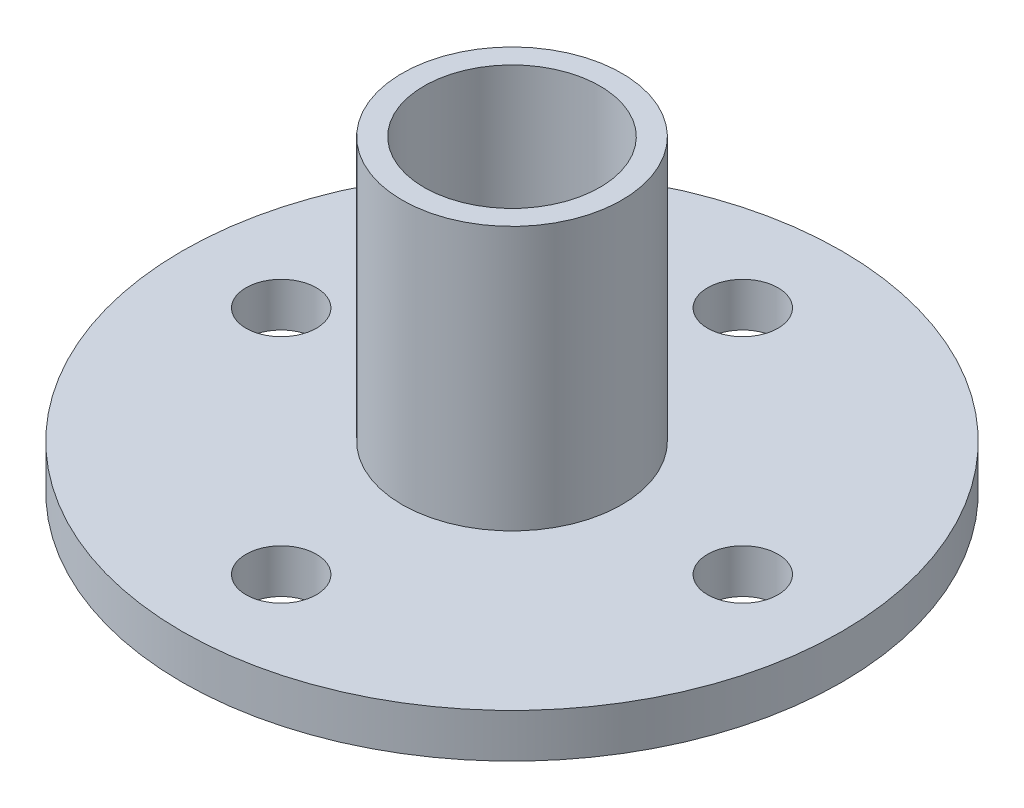
ISO-10303-21;
HEADER;
FILE_DESCRIPTION(('STEP AP214'),'2;1');
FILE_NAME('part.step','',(''),(''),'','','');
FILE_SCHEMA(('AUTOMOTIVE_DESIGN { 1 0 10303 214 1 1 1 1 }'));
ENDSEC;
DATA;
#1=APPLICATION_CONTEXT('core data for automotive mechanical design processes');
#2=APPLICATION_PROTOCOL_DEFINITION('international standard','automotive_design',2000,#1);
#3=PRODUCT_CONTEXT('',#1,'mechanical');
#4=PRODUCT('Part','Part','',(#3));
#5=PRODUCT_RELATED_PRODUCT_CATEGORY('part','',(#4));
#6=PRODUCT_DEFINITION_FORMATION('','',#4);
#7=PRODUCT_DEFINITION_CONTEXT('part definition',#1,'design');
#8=PRODUCT_DEFINITION('design','',#6,#7);
#9=PRODUCT_DEFINITION_SHAPE('','',#8);
#10=(LENGTH_UNIT() NAMED_UNIT(*) SI_UNIT(.MILLI.,.METRE.));
#11=(NAMED_UNIT(*) PLANE_ANGLE_UNIT() SI_UNIT($,.RADIAN.));
#12=(NAMED_UNIT(*) SI_UNIT($,.STERADIAN.) SOLID_ANGLE_UNIT());
#13=UNCERTAINTY_MEASURE_WITH_UNIT(LENGTH_MEASURE(1.E-05),#10,'distance_accuracy_value','');
#14=(GEOMETRIC_REPRESENTATION_CONTEXT(3) GLOBAL_UNCERTAINTY_ASSIGNED_CONTEXT((#13)) GLOBAL_UNIT_ASSIGNED_CONTEXT((#10,
#11,#12)) REPRESENTATION_CONTEXT('',''));
#15=CARTESIAN_POINT('',(0.,0.,0.));
#16=DIRECTION('',(0.,0.,1.));
#17=DIRECTION('',(1.,0.,0.));
#18=AXIS2_PLACEMENT_3D('',#15,#16,#17);
#19=CARTESIAN_POINT('',(0.,2.,0.));
#20=DIRECTION('',(0.,-1.,0.));
#21=DIRECTION('',(0.,0.,-1.));
#22=AXIS2_PLACEMENT_3D('',#19,#20,#21);
#23=CYLINDRICAL_SURFACE('',#22,15.);
#24=CARTESIAN_POINT('',(0.,2.,0.));
#25=DIRECTION('',(0.,1.,0.));
#26=DIRECTION('',(0.,0.,1.));
#27=AXIS2_PLACEMENT_3D('',#24,#25,#26);
#28=CIRCLE('',#27,15.);
#29=CARTESIAN_POINT('',(0.,2.,15.));
#30=VERTEX_POINT('',#29);
#31=EDGE_CURVE('E10',#30,#30,#28,.T.);
#32=ORIENTED_EDGE('',*,*,#31,.F.);
#33=EDGE_LOOP('',(#32));
#34=FACE_BOUND('',#33,.T.);
#35=CARTESIAN_POINT('',(0.,0.,0.));
#36=DIRECTION('',(0.,1.,0.));
#37=DIRECTION('',(0.,0.,1.));
#38=AXIS2_PLACEMENT_3D('',#35,#36,#37);
#39=CIRCLE('',#38,15.);
#40=CARTESIAN_POINT('',(0.,0.,15.));
#41=VERTEX_POINT('',#40);
#42=EDGE_CURVE('E44',#41,#41,#39,.T.);
#43=ORIENTED_EDGE('',*,*,#42,.T.);
#44=EDGE_LOOP('',(#43));
#45=FACE_BOUND('',#44,.T.);
#46=ADVANCED_FACE('F37',(#34,#45),#23,.T.);
#47=CARTESIAN_POINT('',(0.,2.,0.));
#48=DIRECTION('',(0.,1.,0.));
#49=DIRECTION('',(0.,0.,1.));
#50=AXIS2_PLACEMENT_3D('',#47,#48,#49);
#51=PLANE('',#50);
#52=CARTESIAN_POINT('',(0.,2.,-10.5));
#53=DIRECTION('',(0.,1.,0.));
#54=DIRECTION('',(0.,0.,1.));
#55=AXIS2_PLACEMENT_3D('',#52,#53,#54);
#56=CIRCLE('',#55,1.6);
#57=CARTESIAN_POINT('',(0.,2.,-8.9));
#58=VERTEX_POINT('',#57);
#59=EDGE_CURVE('E63',#58,#58,#56,.T.);
#60=ORIENTED_EDGE('',*,*,#59,.F.);
#61=EDGE_LOOP('',(#60));
#62=FACE_BOUND('',#61,.T.);
#63=CARTESIAN_POINT('',(10.5,2.,0.));
#64=DIRECTION('',(0.,1.,0.));
#65=DIRECTION('',(0.,0.,1.));
#66=AXIS2_PLACEMENT_3D('',#63,#64,#65);
#67=CIRCLE('',#66,1.6);
#68=CARTESIAN_POINT('',(10.5,2.,1.60000000000004));
#69=VERTEX_POINT('',#68);
#70=EDGE_CURVE('E134',#69,#69,#67,.T.);
#71=ORIENTED_EDGE('',*,*,#70,.F.);
#72=EDGE_LOOP('',(#71));
#73=FACE_BOUND('',#72,.T.);
#74=CARTESIAN_POINT('',(0.,2.,10.5));
#75=DIRECTION('',(0.,1.,0.));
#76=DIRECTION('',(0.,0.,1.));
#77=AXIS2_PLACEMENT_3D('',#74,#75,#76);
#78=CIRCLE('',#77,1.6);
#79=CARTESIAN_POINT('',(0.,2.,12.1));
#80=VERTEX_POINT('',#79);
#81=EDGE_CURVE('E124',#80,#80,#78,.T.);
#82=ORIENTED_EDGE('',*,*,#81,.F.);
#83=EDGE_LOOP('',(#82));
#84=FACE_BOUND('',#83,.T.);
#85=CARTESIAN_POINT('',(-10.5,2.,-1.09981662173559E-13));
#86=DIRECTION('',(0.,1.,0.));
#87=DIRECTION('',(0.,0.,1.));
#88=AXIS2_PLACEMENT_3D('',#85,#86,#87);
#89=CIRCLE('',#88,1.6);
#90=CARTESIAN_POINT('',(-10.5,2.,1.59999999999989));
#91=VERTEX_POINT('',#90);
#92=EDGE_CURVE('E135',#91,#91,#89,.T.);
#93=ORIENTED_EDGE('',*,*,#92,.F.);
#94=EDGE_LOOP('',(#93));
#95=FACE_BOUND('',#94,.T.);
#96=CARTESIAN_POINT('',(0.,2.,0.));
#97=DIRECTION('',(0.,1.,0.));
#98=DIRECTION('',(0.,0.,1.));
#99=AXIS2_PLACEMENT_3D('',#96,#97,#98);
#100=CIRCLE('',#99,5.);
#101=CARTESIAN_POINT('',(0.,2.,5.));
#102=VERTEX_POINT('',#101);
#103=EDGE_CURVE('E52',#102,#102,#100,.T.);
#104=ORIENTED_EDGE('',*,*,#103,.F.);
#105=EDGE_LOOP('',(#104));
#106=FACE_BOUND('',#105,.T.);
#107=ORIENTED_EDGE('',*,*,#31,.T.);
#108=EDGE_LOOP('',(#107));
#109=FACE_BOUND('',#108,.T.);
#110=ADVANCED_FACE('F87',(#62,#73,#84,#95,#106,#109),#51,.T.);
#111=CARTESIAN_POINT('',(0.,0.,0.));
#112=DIRECTION('',(0.,1.,0.));
#113=DIRECTION('',(0.,0.,1.));
#114=AXIS2_PLACEMENT_3D('',#111,#112,#113);
#115=PLANE('',#114);
#116=CARTESIAN_POINT('',(0.,0.,-10.5));
#117=DIRECTION('',(0.,1.,0.));
#118=DIRECTION('',(0.,0.,1.));
#119=AXIS2_PLACEMENT_3D('',#116,#117,#118);
#120=CIRCLE('',#119,1.6);
#121=CARTESIAN_POINT('',(0.,0.,-8.9));
#122=VERTEX_POINT('',#121);
#123=EDGE_CURVE('E40',#122,#122,#120,.T.);
#124=ORIENTED_EDGE('',*,*,#123,.T.);
#125=EDGE_LOOP('',(#124));
#126=FACE_BOUND('',#125,.T.);
#127=CARTESIAN_POINT('',(10.5,0.,0.));
#128=DIRECTION('',(0.,1.,0.));
#129=DIRECTION('',(0.,0.,1.));
#130=AXIS2_PLACEMENT_3D('',#127,#128,#129);
#131=CIRCLE('',#130,1.6);
#132=CARTESIAN_POINT('',(10.5,0.,1.60000000000004));
#133=VERTEX_POINT('',#132);
#134=EDGE_CURVE('E65',#133,#133,#131,.T.);
#135=ORIENTED_EDGE('',*,*,#134,.T.);
#136=EDGE_LOOP('',(#135));
#137=FACE_BOUND('',#136,.T.);
#138=CARTESIAN_POINT('',(0.,0.,10.5));
#139=DIRECTION('',(0.,1.,0.));
#140=DIRECTION('',(0.,0.,1.));
#141=AXIS2_PLACEMENT_3D('',#138,#139,#140);
#142=CIRCLE('',#141,1.6);
#143=CARTESIAN_POINT('',(0.,0.,12.1));
#144=VERTEX_POINT('',#143);
#145=EDGE_CURVE('E62',#144,#144,#142,.T.);
#146=ORIENTED_EDGE('',*,*,#145,.T.);
#147=EDGE_LOOP('',(#146));
#148=FACE_BOUND('',#147,.T.);
#149=CARTESIAN_POINT('',(-10.5,0.,-1.09981662173559E-13));
#150=DIRECTION('',(0.,1.,0.));
#151=DIRECTION('',(0.,0.,1.));
#152=AXIS2_PLACEMENT_3D('',#149,#150,#151);
#153=CIRCLE('',#152,1.6);
#154=CARTESIAN_POINT('',(-10.5,0.,1.59999999999989));
#155=VERTEX_POINT('',#154);
#156=EDGE_CURVE('E59',#155,#155,#153,.T.);
#157=ORIENTED_EDGE('',*,*,#156,.T.);
#158=EDGE_LOOP('',(#157));
#159=FACE_BOUND('',#158,.T.);
#160=CARTESIAN_POINT('',(0.,0.,0.));
#161=DIRECTION('',(0.,1.,0.));
#162=DIRECTION('',(0.,0.,1.));
#163=AXIS2_PLACEMENT_3D('',#160,#161,#162);
#164=CIRCLE('',#163,4.);
#165=CARTESIAN_POINT('',(0.,0.,4.));
#166=VERTEX_POINT('',#165);
#167=EDGE_CURVE('E55',#166,#166,#164,.T.);
#168=ORIENTED_EDGE('',*,*,#167,.T.);
#169=EDGE_LOOP('',(#168));
#170=FACE_BOUND('',#169,.T.);
#171=ORIENTED_EDGE('',*,*,#42,.F.);
#172=EDGE_LOOP('',(#171));
#173=FACE_BOUND('',#172,.T.);
#174=ADVANCED_FACE('F72',(#126,#137,#148,#159,#170,#173),#115,.F.);
#175=CARTESIAN_POINT('',(0.,14.,0.));
#176=DIRECTION('',(0.,1.,0.));
#177=DIRECTION('',(0.,0.,1.));
#178=AXIS2_PLACEMENT_3D('',#175,#176,#177);
#179=PLANE('',#178);
#180=CARTESIAN_POINT('',(0.,14.,0.));
#181=DIRECTION('',(0.,1.,0.));
#182=DIRECTION('',(0.,0.,1.));
#183=AXIS2_PLACEMENT_3D('',#180,#181,#182);
#184=CIRCLE('',#183,5.);
#185=CARTESIAN_POINT('',(0.,14.,5.));
#186=VERTEX_POINT('',#185);
#187=EDGE_CURVE('E49',#186,#186,#184,.T.);
#188=ORIENTED_EDGE('',*,*,#187,.T.);
#189=EDGE_LOOP('',(#188));
#190=FACE_BOUND('',#189,.T.);
#191=CARTESIAN_POINT('',(0.,14.,0.));
#192=DIRECTION('',(0.,1.,0.));
#193=DIRECTION('',(0.,0.,1.));
#194=AXIS2_PLACEMENT_3D('',#191,#192,#193);
#195=CIRCLE('',#194,4.);
#196=CARTESIAN_POINT('',(0.,14.,4.));
#197=VERTEX_POINT('',#196);
#198=EDGE_CURVE('E58',#197,#197,#195,.T.);
#199=ORIENTED_EDGE('',*,*,#198,.F.);
#200=EDGE_LOOP('',(#199));
#201=FACE_BOUND('',#200,.T.);
#202=ADVANCED_FACE('F98',(#190,#201),#179,.T.);
#203=CARTESIAN_POINT('',(0.,14.,0.));
#204=DIRECTION('',(0.,-1.,0.));
#205=DIRECTION('',(0.,0.,-1.));
#206=AXIS2_PLACEMENT_3D('',#203,#204,#205);
#207=CYLINDRICAL_SURFACE('',#206,5.);
#208=ORIENTED_EDGE('',*,*,#187,.F.);
#209=EDGE_LOOP('',(#208));
#210=FACE_BOUND('',#209,.T.);
#211=ORIENTED_EDGE('',*,*,#103,.T.);
#212=EDGE_LOOP('',(#211));
#213=FACE_BOUND('',#212,.T.);
#214=ADVANCED_FACE('F102',(#210,#213),#207,.T.);
#215=CARTESIAN_POINT('',(0.,14.,0.));
#216=DIRECTION('',(0.,-1.,0.));
#217=DIRECTION('',(0.,0.,-1.));
#218=AXIS2_PLACEMENT_3D('',#215,#216,#217);
#219=CYLINDRICAL_SURFACE('',#218,4.);
#220=ORIENTED_EDGE('',*,*,#198,.T.);
#221=EDGE_LOOP('',(#220));
#222=FACE_BOUND('',#221,.T.);
#223=ORIENTED_EDGE('',*,*,#167,.F.);
#224=EDGE_LOOP('',(#223));
#225=FACE_BOUND('',#224,.T.);
#226=ADVANCED_FACE('F107',(#222,#225),#219,.F.);
#227=CARTESIAN_POINT('',(-10.5,-10.,-1.09981662173559E-13));
#228=DIRECTION('',(0.,1.,0.));
#229=DIRECTION('',(0.,0.,1.));
#230=AXIS2_PLACEMENT_3D('',#227,#228,#229);
#231=CYLINDRICAL_SURFACE('',#230,1.6);
#232=ORIENTED_EDGE('',*,*,#92,.T.);
#233=EDGE_LOOP('',(#232));
#234=FACE_BOUND('',#233,.T.);
#235=ORIENTED_EDGE('',*,*,#156,.F.);
#236=EDGE_LOOP('',(#235));
#237=FACE_BOUND('',#236,.T.);
#238=ADVANCED_FACE('F112',(#234,#237),#231,.F.);
#239=CARTESIAN_POINT('',(0.,-10.,10.5));
#240=DIRECTION('',(0.,1.,0.));
#241=DIRECTION('',(0.,0.,1.));
#242=AXIS2_PLACEMENT_3D('',#239,#240,#241);
#243=CYLINDRICAL_SURFACE('',#242,1.6);
#244=ORIENTED_EDGE('',*,*,#81,.T.);
#245=EDGE_LOOP('',(#244));
#246=FACE_BOUND('',#245,.T.);
#247=ORIENTED_EDGE('',*,*,#145,.F.);
#248=EDGE_LOOP('',(#247));
#249=FACE_BOUND('',#248,.T.);
#250=ADVANCED_FACE('F82',(#246,#249),#243,.F.);
#251=CARTESIAN_POINT('',(10.5,-10.,0.));
#252=DIRECTION('',(0.,1.,0.));
#253=DIRECTION('',(0.,0.,1.));
#254=AXIS2_PLACEMENT_3D('',#251,#252,#253);
#255=CYLINDRICAL_SURFACE('',#254,1.6);
#256=ORIENTED_EDGE('',*,*,#70,.T.);
#257=EDGE_LOOP('',(#256));
#258=FACE_BOUND('',#257,.T.);
#259=ORIENTED_EDGE('',*,*,#134,.F.);
#260=EDGE_LOOP('',(#259));
#261=FACE_BOUND('',#260,.T.);
#262=ADVANCED_FACE('F76',(#258,#261),#255,.F.);
#263=CARTESIAN_POINT('',(0.,-10.,-10.5));
#264=DIRECTION('',(0.,1.,0.));
#265=DIRECTION('',(0.,0.,1.));
#266=AXIS2_PLACEMENT_3D('',#263,#264,#265);
#267=CYLINDRICAL_SURFACE('',#266,1.6);
#268=ORIENTED_EDGE('',*,*,#59,.T.);
#269=EDGE_LOOP('',(#268));
#270=FACE_BOUND('',#269,.T.);
#271=ORIENTED_EDGE('',*,*,#123,.F.);
#272=EDGE_LOOP('',(#271));
#273=FACE_BOUND('',#272,.T.);
#274=ADVANCED_FACE('F74',(#270,#273),#267,.F.);
#275=CLOSED_SHELL('',(#46,#110,#174,#202,#214,#226,#238,#250,#262,#274));
#276=MANIFOLD_SOLID_BREP('B2',#275);
#277=ADVANCED_BREP_SHAPE_REPRESENTATION('',(#18,#276),#14);
#278=SHAPE_DEFINITION_REPRESENTATION(#9,#277);
ENDSEC;
END-ISO-10303-21;
